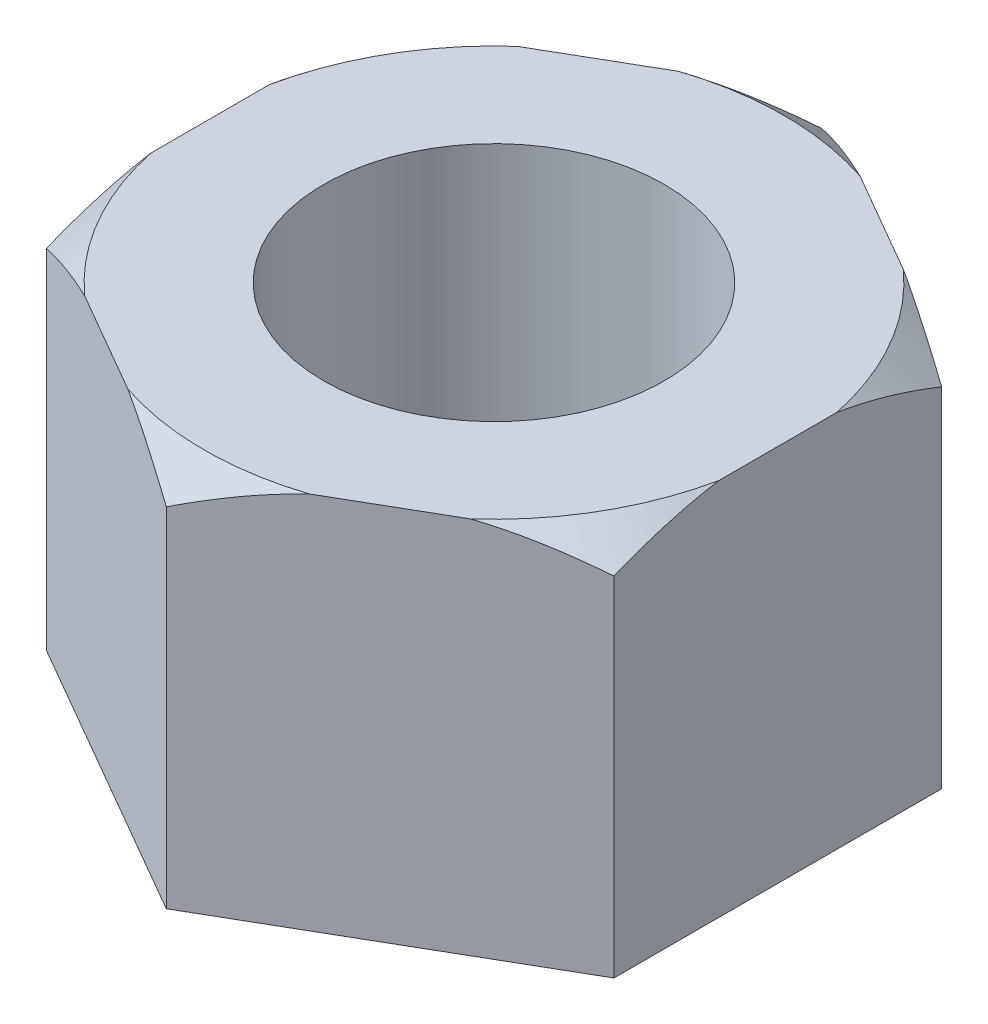
ISO-10303-21;
HEADER;
FILE_DESCRIPTION(('STEP AP214'),'2;1');
FILE_NAME('part.step','',(''),(''),'','','');
FILE_SCHEMA(('AUTOMOTIVE_DESIGN { 1 0 10303 214 1 1 1 1 }'));
ENDSEC;
DATA;
#1=APPLICATION_CONTEXT('core data for automotive mechanical design processes');
#2=APPLICATION_PROTOCOL_DEFINITION('international standard','automotive_design',2000,#1);
#3=PRODUCT_CONTEXT('',#1,'mechanical');
#4=PRODUCT('Part','Part','',(#3));
#5=PRODUCT_RELATED_PRODUCT_CATEGORY('part','',(#4));
#6=PRODUCT_DEFINITION_FORMATION('','',#4);
#7=PRODUCT_DEFINITION_CONTEXT('part definition',#1,'design');
#8=PRODUCT_DEFINITION('design','',#6,#7);
#9=PRODUCT_DEFINITION_SHAPE('','',#8);
#10=(LENGTH_UNIT() NAMED_UNIT(*) SI_UNIT(.MILLI.,.METRE.));
#11=(NAMED_UNIT(*) PLANE_ANGLE_UNIT() SI_UNIT($,.RADIAN.));
#12=(NAMED_UNIT(*) SI_UNIT($,.STERADIAN.) SOLID_ANGLE_UNIT());
#13=UNCERTAINTY_MEASURE_WITH_UNIT(LENGTH_MEASURE(1.E-05),#10,'distance_accuracy_value','');
#14=(GEOMETRIC_REPRESENTATION_CONTEXT(3) GLOBAL_UNCERTAINTY_ASSIGNED_CONTEXT((#13)) GLOBAL_UNIT_ASSIGNED_CONTEXT((#10,
#11,#12)) REPRESENTATION_CONTEXT('',''));
#15=CARTESIAN_POINT('',(0.,0.,0.));
#16=DIRECTION('',(0.,0.,1.));
#17=DIRECTION('',(1.,0.,0.));
#18=AXIS2_PLACEMENT_3D('',#15,#16,#17);
#19=CARTESIAN_POINT('',(7.5,10.,4.3301270189222));
#20=DIRECTION('',(-1.,0.,0.));
#21=DIRECTION('',(0.,0.,1.));
#22=AXIS2_PLACEMENT_3D('',#19,#20,#21);
#23=PLANE('',#22);
#24=CARTESIAN_POINT('',(7.5,6.4146807288749,9.54860259616033));
#25=CARTESIAN_POINT('',(7.5,6.55866470793268,9.31969888326524));
#26=CARTESIAN_POINT('',(7.5,6.70127608196248,9.08991961782729));
#27=CARTESIAN_POINT('',(7.5,6.9831614984986,8.62827495631653));
#28=CARTESIAN_POINT('',(7.5,7.12243500815842,8.39640923518796));
#29=CARTESIAN_POINT('',(7.5,7.39761066195499,7.92930352378797));
#30=CARTESIAN_POINT('',(7.5,7.53349527279304,7.6940531747953));
#31=CARTESIAN_POINT('',(7.5,7.80042851570543,7.22083136773926));
#32=CARTESIAN_POINT('',(7.5,7.93147735724859,6.98286002812605));
#33=CARTESIAN_POINT('',(7.5,8.19348714057653,6.49301317702861));
#34=CARTESIAN_POINT('',(7.5,8.32417949383914,6.24099340191937));
#35=CARTESIAN_POINT('',(7.5,8.57772029321263,5.73299371520247));
#36=CARTESIAN_POINT('',(7.5,8.70056809257681,5.47701347922916));
#37=CARTESIAN_POINT('',(7.5,8.93635393995992,4.96099736227989));
#38=CARTESIAN_POINT('',(7.5,9.04930763315424,4.70096867898878));
#39=CARTESIAN_POINT('',(7.5,9.26318122287672,4.17604149538977));
#40=CARTESIAN_POINT('',(7.5,9.36410386088361,3.91114412043492));
#41=CARTESIAN_POINT('',(7.5,9.55957482296783,3.35198287202365));
#42=CARTESIAN_POINT('',(7.5,9.6527283966905,3.05722436483859));
#43=CARTESIAN_POINT('',(7.5,9.81725088359778,2.4615957159776));
#44=CARTESIAN_POINT('',(7.5,9.8886203231011,2.16072572214649));
#45=CARTESIAN_POINT('',(7.5,10.0043803715225,1.55869513994768));
#46=CARTESIAN_POINT('',(7.5,10.0491814702344,1.25761506323823));
#47=CARTESIAN_POINT('',(7.5,10.1103156838857,0.652561136736859));
#48=CARTESIAN_POINT('',(7.5,10.1266535688715,0.34858778040604));
#49=CARTESIAN_POINT('',(7.5,10.1295486049696,-0.261048804335957));
#50=CARTESIAN_POINT('',(7.5,10.1159542142384,-0.566712780577731));
#51=CARTESIAN_POINT('',(7.5,10.0597955361564,-1.1753525230448));
#52=CARTESIAN_POINT('',(7.5,10.0172264452488,-1.47832783509278));
#53=CARTESIAN_POINT('',(7.5,9.9053632745284,-2.08429329149563));
#54=CARTESIAN_POINT('',(7.5,9.83564650006926,-2.38720380645196));
#55=CARTESIAN_POINT('',(7.5,9.67384662527949,-2.98689489645898));
#56=CARTESIAN_POINT('',(7.5,9.58176280560265,-3.28367527402525));
#57=CARTESIAN_POINT('',(7.5,9.38737033536774,-3.84810885844041));
#58=CARTESIAN_POINT('',(7.5,9.28641155947947,-4.11623386519152));
#59=CARTESIAN_POINT('',(7.5,9.07201796623266,-4.64748421059007));
#60=CARTESIAN_POINT('',(7.5,8.95858013158622,-4.91060832196496));
#61=CARTESIAN_POINT('',(7.5,8.72147599881307,-5.43271599161977));
#62=CARTESIAN_POINT('',(7.5,8.59779258307476,-5.69169172133084));
#63=CARTESIAN_POINT('',(7.5,8.34232617541051,-6.20556826875717));
#64=CARTESIAN_POINT('',(7.5,8.21054388966427,-6.46046943931761));
#65=CARTESIAN_POINT('',(7.5,7.94625276501215,-6.95579164422827));
#66=CARTESIAN_POINT('',(7.5,7.81402230609473,-7.19636185504697));
#67=CARTESIAN_POINT('',(7.5,7.54459545688915,-7.67471235741192));
#68=CARTESIAN_POINT('',(7.5,7.40739884233038,-7.91249252231653));
#69=CARTESIAN_POINT('',(7.5,7.12953897907714,-8.38453409101417));
#70=CARTESIAN_POINT('',(7.5,6.98889466591913,-8.61880667378094));
#71=CARTESIAN_POINT('',(7.5,6.70419337824544,-9.08521788143551));
#72=CARTESIAN_POINT('',(7.5,6.56013697109618,-9.31735685231481));
#73=CARTESIAN_POINT('',(7.5,6.41468072887491,-9.54860259616033));
#74=B_SPLINE_CURVE_WITH_KNOTS('',3,(#24,#25,#26,#27,#28,#29,#30,#31,#32,#33,#34,#35,#36,#37,#38,
#39,#40,#41,#42,#43,#44,#45,#46,#47,#48,#49,#50,#51,#52,#53,#54,#55,#56,#57,#58,#59,#60,#61,#62,
#63,#64,#65,#66,#67,#68,#69,#70,#71,#72,#73),.UNSPECIFIED.,.F.,.F.,(4,2,2,2,2,2,2,2,2,2,2,2,2,2,
2,2,2,2,2,2,2,2,2,2,4),(0.,0.811277740605028,1.62268413990396,2.43766124898074,3.25260301452779,
4.10416631223329,4.95579972693622,5.80606121432494,6.65612858345475,7.58282625313955,
8.50950153143905,9.42145882476036,10.3332632717645,11.2496946338952,12.1662779631802,
13.0977432745438,14.0292385467162,14.8883768137919,15.7477232687539,16.6085355946927,
17.4692729684363,18.2927515516822,19.1162673695701,19.93598005651,20.7555573846301),.UNSPECIFIED.);
#75=CARTESIAN_POINT('',(7.5,9.2,4.3301270189222));
#76=VERTEX_POINT('',#75);
#77=CARTESIAN_POINT('',(7.5,10.,1.55868275293956));
#78=VERTEX_POINT('',#77);
#79=EDGE_CURVE('E246',#76,#78,#74,.T.);
#80=ORIENTED_EDGE('',*,*,#79,.F.);
#81=DIRECTION('',(0.,-1.,0.));
#82=VECTOR('',#81,1.);
#83=CARTESIAN_POINT('',(7.5,10.,4.3301270189222));
#84=LINE('',#83,#82);
#85=CARTESIAN_POINT('',(7.5,0.,4.3301270189222));
#86=VERTEX_POINT('',#85);
#87=EDGE_CURVE('E163',#76,#86,#84,.T.);
#88=ORIENTED_EDGE('',*,*,#87,.T.);
#89=DIRECTION('',(0.,0.,-1.));
#90=VECTOR('',#89,1.);
#91=CARTESIAN_POINT('',(7.5,0.,4.3301270189222));
#92=LINE('',#91,#90);
#93=CARTESIAN_POINT('',(7.5,0.,-4.33012701892219));
#94=VERTEX_POINT('',#93);
#95=EDGE_CURVE('E164',#86,#94,#92,.T.);
#96=ORIENTED_EDGE('',*,*,#95,.T.);
#97=DIRECTION('',(0.,-1.,0.));
#98=VECTOR('',#97,1.);
#99=CARTESIAN_POINT('',(7.5,10.,-4.33012701892219));
#100=LINE('',#99,#98);
#101=CARTESIAN_POINT('',(7.50000000000001,9.2,-4.33012701892219));
#102=VERTEX_POINT('',#101);
#103=EDGE_CURVE('E188',#102,#94,#100,.T.);
#104=ORIENTED_EDGE('',*,*,#103,.F.);
#105=CARTESIAN_POINT('',(7.5,10.,-1.55868275293956));
#106=VERTEX_POINT('',#105);
#107=EDGE_CURVE('E168',#106,#102,#74,.T.);
#108=ORIENTED_EDGE('',*,*,#107,.F.);
#109=DIRECTION('',(0.,0.,-1.));
#110=VECTOR('',#109,1.);
#111=CARTESIAN_POINT('',(7.5,10.,4.3301270189222));
#112=LINE('',#111,#110);
#113=EDGE_CURVE('E149',#78,#106,#112,.T.);
#114=ORIENTED_EDGE('',*,*,#113,.F.);
#115=EDGE_LOOP('',(#80,#88,#96,#104,#108,#114));
#116=FACE_BOUND('',#115,.T.);
#117=ADVANCED_FACE('F34',(#116),#23,.F.);
#118=CARTESIAN_POINT('',(7.5,10.,-4.33012701892219));
#119=DIRECTION('',(-0.5,0.,0.866025403784438));
#120=DIRECTION('',(0.866025403784438,0.,0.5));
#121=AXIS2_PLACEMENT_3D('',#118,#119,#120);
#122=PLANE('',#121);
#123=CARTESIAN_POINT('',(12.7184755772381,5.8989983296073,-1.31723873964426));
#124=CARTESIAN_POINT('',(12.5243502850892,6.04421555853221,-1.42931702932297));
#125=CARTESIAN_POINT('',(12.3295944219355,6.18832061822437,-1.54175937934103));
#126=CARTESIAN_POINT('',(11.9385954425742,6.4738621209527,-1.76750274532811));
#127=CARTESIAN_POINT('',(11.7423521833624,6.61529830271068,-1.88080384386069));
#128=CARTESIAN_POINT('',(11.3476781455406,6.89539258545051,-2.10866900583928));
#129=CARTESIAN_POINT('',(11.149243009079,7.03404251662476,-2.22323558529205));
#130=CARTESIAN_POINT('',(10.7504415445799,7.30758100705959,-2.45348371817387));
#131=CARTESIAN_POINT('',(10.550075268657,7.44246966744344,-2.56916524151446));
#132=CARTESIAN_POINT('',(10.1378822340322,7.7138317082138,-2.80714500101316));
#133=CARTESIAN_POINT('',(9.92595110986029,7.85009436434028,-2.92950349260348));
#134=CARTESIAN_POINT('',(9.49928652802421,8.11663326408466,-3.17583840378022));
#135=CARTESIAN_POINT('',(9.28455319380478,8.24690977027282,-3.29981475209579));
#136=CARTESIAN_POINT('',(8.85204321072868,8.50002443785826,-3.54952450725198));
#137=CARTESIAN_POINT('',(8.63426938545827,8.62286900022022,-3.67525628389431));
#138=CARTESIAN_POINT('',(8.19508815512445,8.85952316699067,-3.92881768545057));
#139=CARTESIAN_POINT('',(7.97368123390392,8.97333396288743,-4.05664703101769));
#140=CARTESIAN_POINT('',(7.49455265710063,9.20543657288756,-4.33327204381151));
#141=CARTESIAN_POINT('',(7.2361985313122,9.32200774288982,-4.48243286788171));
#142=CARTESIAN_POINT('',(6.71370360269358,9.53664805961345,-4.78409545556988));
#143=CARTESIAN_POINT('',(6.44956262853113,9.63471665769733,-4.93659731810658));
#144=CARTESIAN_POINT('',(5.91995172016573,9.80629404308821,-5.24236831861711));
#145=CARTESIAN_POINT('',(5.65457504656057,9.88018013554724,-5.3955836125597));
#146=CARTESIAN_POINT('',(5.11921600343416,10.0010181522418,-5.70467330022183));
#147=CARTESIAN_POINT('',(4.84923451867346,10.0479751918635,-5.86054718312464));
#148=CARTESIAN_POINT('',(4.30290916010559,10.1117692479579,-6.17596827595892));
#149=CARTESIAN_POINT('',(4.02652843626419,10.1281968774021,-6.33553676126757));
#150=CARTESIAN_POINT('',(3.4737747413206,10.1282095798713,-6.65466925583881));
#151=CARTESIAN_POINT('',(3.19740177017824,10.1117953488751,-6.81423326512459));
#152=CARTESIAN_POINT('',(2.64261191867031,10.0470334963461,-7.13454133523637));
#153=CARTESIAN_POINT('',(2.36424513927631,9.99812704049393,-7.29525647025294));
#154=CARTESIAN_POINT('',(1.81250730789778,9.87182749108949,-7.61380245572144));
#155=CARTESIAN_POINT('',(1.53913650981073,9.79443295396545,-7.77163315958558));
#156=CARTESIAN_POINT('',(0.969081298006805,9.60652279375089,-8.10075468957353));
#157=CARTESIAN_POINT('',(0.673068637860406,9.49333235194954,-8.27165767859259));
#158=CARTESIAN_POINT('',(0.0881197627511148,9.2445232857301,-8.6093780690991));
#159=CARTESIAN_POINT('',(-0.20081188244584,9.10889059407921,-8.77619283223097));
#160=CARTESIAN_POINT('',(-0.773285390285749,8.81998492416099,-9.10671056608627));
#161=CARTESIAN_POINT('',(-1.05680110653056,8.66664363149776,-9.2703984411797));
#162=CARTESIAN_POINT('',(-1.61812782735235,8.3468989499349,-9.59448057454949));
#163=CARTESIAN_POINT('',(-1.89594006584022,8.18049842469927,-9.75487554522464));
#164=CARTESIAN_POINT('',(-2.43341136742252,7.84600106515578,-10.0651847458749));
#165=CARTESIAN_POINT('',(-2.69329509338522,7.67838252010584,-10.2152286850174));
#166=CARTESIAN_POINT('',(-3.20950539518864,7.33596532413344,-10.5132628417221));
#167=CARTESIAN_POINT('',(-3.46583167965445,7.16116608966046,-10.6612528910588));
#168=CARTESIAN_POINT('',(-3.97295962568591,6.80764202577994,-10.9540433472137));
#169=CARTESIAN_POINT('',(-4.22379088136879,6.62897358019585,-11.0988608402033));
#170=CARTESIAN_POINT('',(-4.72290996080319,6.26712504051059,-11.3870273750725));
#171=CARTESIAN_POINT('',(-4.97119844905564,6.08394617004109,-11.5303768006017));
#172=CARTESIAN_POINT('',(-5.21847557723813,5.8989983296073,-11.6731423171223));
#173=B_SPLINE_CURVE_WITH_KNOTS('',3,(#123,#124,#125,#126,#127,#128,#129,#130,#131,#132,#133,
#134,#135,#136,#137,#138,#139,#140,#141,#142,#143,#144,#145,#146,#147,#148,#149,#150,#151,#152,
#153,#154,#155,#156,#157,#158,#159,#160,#161,#162,#163,#164,#165,#166,#167,#168,#169,#170,#171,
#172),.UNSPECIFIED.,.F.,.F.,(4,2,2,2,2,2,2,2,2,2,2,2,2,2,2,2,2,2,2,2,2,2,2,2,4),(0.,
0.801260175970938,1.60259839107477,2.40601796174139,3.20941591128102,4.0496360731215,
4.88981934516788,5.72926837085867,6.56860649470337,7.5289850593744,8.48939209667592,
9.43400791684239,10.3784442402903,11.3354561531533,12.2924477854061,13.2663401902438,
14.2402819517627,15.3194374101153,16.3992718842948,17.4834206984393,18.5673324381988,
19.5983954401868,20.6295423996074,21.6504268575923,22.6710373469262),.UNSPECIFIED.);
#174=CARTESIAN_POINT('',(5.09985886048633,10.,-5.7158491519135));
#175=VERTEX_POINT('',#174);
#176=EDGE_CURVE('E142',#102,#175,#173,.T.);
#177=ORIENTED_EDGE('',*,*,#176,.F.);
#178=ORIENTED_EDGE('',*,*,#103,.T.);
#179=DIRECTION('',(-0.866025403784438,0.,-0.5));
#180=VECTOR('',#179,1.);
#181=CARTESIAN_POINT('',(7.5,0.,-4.33012701892219));
#182=LINE('',#181,#180);
#183=CARTESIAN_POINT('',(0.,0.,-8.66025403784439));
#184=VERTEX_POINT('',#183);
#185=EDGE_CURVE('E167',#94,#184,#182,.T.);
#186=ORIENTED_EDGE('',*,*,#185,.T.);
#187=DIRECTION('',(0.,-1.,0.));
#188=VECTOR('',#187,1.);
#189=CARTESIAN_POINT('',(0.,10.,-8.66025403784439));
#190=LINE('',#189,#188);
#191=CARTESIAN_POINT('',(0.,9.2,-8.66025403784439));
#192=VERTEX_POINT('',#191);
#193=EDGE_CURVE('E141',#192,#184,#190,.T.);
#194=ORIENTED_EDGE('',*,*,#193,.F.);
#195=CARTESIAN_POINT('',(2.40014113951367,10.,-7.27453190485307));
#196=VERTEX_POINT('',#195);
#197=EDGE_CURVE('E126',#196,#192,#173,.T.);
#198=ORIENTED_EDGE('',*,*,#197,.F.);
#199=DIRECTION('',(-0.866025403784438,0.,-0.5));
#200=VECTOR('',#199,1.);
#201=CARTESIAN_POINT('',(7.5,10.,-4.33012701892219));
#202=LINE('',#201,#200);
#203=EDGE_CURVE('E139',#175,#196,#202,.T.);
#204=ORIENTED_EDGE('',*,*,#203,.F.);
#205=EDGE_LOOP('',(#177,#178,#186,#194,#198,#204));
#206=FACE_BOUND('',#205,.T.);
#207=ADVANCED_FACE('F138',(#206),#122,.F.);
#208=CARTESIAN_POINT('',(0.,10.,-8.66025403784439));
#209=DIRECTION('',(0.5,0.,0.866025403784439));
#210=DIRECTION('',(0.866025403784439,0.,-0.5));
#211=AXIS2_PLACEMENT_3D('',#208,#209,#210);
#212=PLANE('',#211);
#213=CARTESIAN_POINT('',(5.21847557723814,5.8989983296073,-11.6731423171223));
#214=CARTESIAN_POINT('',(5.02435028508919,6.04421555853221,-11.5610640274436));
#215=CARTESIAN_POINT('',(4.82959442193546,6.18832061822437,-11.4486216774255));
#216=CARTESIAN_POINT('',(4.43859544257423,6.4738621209527,-11.2228783114385));
#217=CARTESIAN_POINT('',(4.24235218336242,6.61529830271068,-11.1095772129059));
#218=CARTESIAN_POINT('',(3.8476781455406,6.89539258545051,-10.8817120509273));
#219=CARTESIAN_POINT('',(3.64924300907903,7.03404251662476,-10.7671454714745));
#220=CARTESIAN_POINT('',(3.25044154457985,7.30758100705959,-10.5368973385927));
#221=CARTESIAN_POINT('',(3.05007526865698,7.44246966744344,-10.4212158152521));
#222=CARTESIAN_POINT('',(2.6378822340322,7.7138317082138,-10.1832360557534));
#223=CARTESIAN_POINT('',(2.42595110986029,7.85009436434028,-10.0608775641631));
#224=CARTESIAN_POINT('',(1.99928652802421,8.11663326408466,-9.81454265298636));
#225=CARTESIAN_POINT('',(1.78455319380478,8.24690977027282,-9.69056630467078));
#226=CARTESIAN_POINT('',(1.35204321072868,8.50002443785826,-9.4408565495146));
#227=CARTESIAN_POINT('',(1.13426938545826,8.62286900022022,-9.31512477287227));
#228=CARTESIAN_POINT('',(0.695088155124448,8.85952316699067,-9.06156337131601));
#229=CARTESIAN_POINT('',(0.47368123390392,8.97333396288743,-8.93373402574889));
#230=CARTESIAN_POINT('',(-0.0054473428993747,9.20543657288756,-8.65710901295506));
#231=CARTESIAN_POINT('',(-0.263801468687802,9.32200774288982,-8.50794818888487));
#232=CARTESIAN_POINT('',(-0.786296397306419,9.53664805961345,-8.20628560119669));
#233=CARTESIAN_POINT('',(-1.05043737146887,9.63471665769733,-8.05378373865999));
#234=CARTESIAN_POINT('',(-1.58004827983427,9.80629404308821,-7.74801273814947));
#235=CARTESIAN_POINT('',(-1.84542495343943,9.88018013554724,-7.59479744420688));
#236=CARTESIAN_POINT('',(-2.38078399656584,10.0010181522418,-7.28570775654475));
#237=CARTESIAN_POINT('',(-2.65076548132655,10.0479751918635,-7.12983387364194));
#238=CARTESIAN_POINT('',(-3.19709083989442,10.1117692479579,-6.81441278080766));
#239=CARTESIAN_POINT('',(-3.47347156373582,10.1281968774021,-6.654844295499));
#240=CARTESIAN_POINT('',(-4.0262252586794,10.1282095798713,-6.33571180092776));
#241=CARTESIAN_POINT('',(-4.30259822982177,10.1117953488751,-6.17614779164198));
#242=CARTESIAN_POINT('',(-4.8573880813297,10.0470334963461,-5.8558397215302));
#243=CARTESIAN_POINT('',(-5.1357548607237,9.99812704049393,-5.69512458651363));
#244=CARTESIAN_POINT('',(-5.68749269210222,9.87182749108949,-5.37657860104514));
#245=CARTESIAN_POINT('',(-5.96086349018927,9.79443295396545,-5.218747897181));
#246=CARTESIAN_POINT('',(-6.5309187019932,9.60652279375088,-4.88962636719305));
#247=CARTESIAN_POINT('',(-6.8269313621396,9.49333235194954,-4.71872337817399));
#248=CARTESIAN_POINT('',(-7.41188023724889,9.24452328573009,-4.38100298766747));
#249=CARTESIAN_POINT('',(-7.70081188244584,9.10889059407921,-4.21418822453561));
#250=CARTESIAN_POINT('',(-8.27328539028575,8.81998492416099,-3.88367049068031));
#251=CARTESIAN_POINT('',(-8.55680110653056,8.66664363149776,-3.71998261558688));
#252=CARTESIAN_POINT('',(-9.11812782735235,8.3468989499349,-3.39590048221709));
#253=CARTESIAN_POINT('',(-9.39594006584022,8.18049842469927,-3.23550551154194));
#254=CARTESIAN_POINT('',(-9.93341136742252,7.84600106515578,-2.9251963108917));
#255=CARTESIAN_POINT('',(-10.1932950933852,7.67838252010584,-2.77515237174914));
#256=CARTESIAN_POINT('',(-10.7095053951886,7.33596532413344,-2.47711821504448));
#257=CARTESIAN_POINT('',(-10.9658316796545,7.16116608966046,-2.32912816570776));
#258=CARTESIAN_POINT('',(-11.4729596256859,6.80764202577994,-2.03633770955292));
#259=CARTESIAN_POINT('',(-11.7237908813688,6.62897358019585,-1.89152021656324));
#260=CARTESIAN_POINT('',(-12.2229099608032,6.26712504051059,-1.6033536816941));
#261=CARTESIAN_POINT('',(-12.4711984490556,6.08394617004109,-1.46000425616487));
#262=CARTESIAN_POINT('',(-12.7184755772381,5.8989983296073,-1.31723873964427));
#263=B_SPLINE_CURVE_WITH_KNOTS('',3,(#213,#214,#215,#216,#217,#218,#219,#220,#221,#222,#223,
#224,#225,#226,#227,#228,#229,#230,#231,#232,#233,#234,#235,#236,#237,#238,#239,#240,#241,#242,
#243,#244,#245,#246,#247,#248,#249,#250,#251,#252,#253,#254,#255,#256,#257,#258,#259,#260,#261,
#262),.UNSPECIFIED.,.F.,.F.,(4,2,2,2,2,2,2,2,2,2,2,2,2,2,2,2,2,2,2,2,2,2,2,2,4),(0.,
0.801260175970937,1.60259839107477,2.40601796174139,3.20941591128102,4.0496360731215,
4.88981934516788,5.72926837085867,6.56860649470337,7.52898505937439,8.48939209667592,
9.43400791684239,10.3784442402903,11.3354561531534,12.2924477854061,13.2663401902438,
14.2402819517627,15.3194374101153,16.3992718842948,17.4834206984393,18.5673324381988,
19.5983954401868,20.6295423996074,21.6504268575923,22.6710373469262),.UNSPECIFIED.);
#264=CARTESIAN_POINT('',(-2.40014113951367,10.,-7.27453190485307));
#265=VERTEX_POINT('',#264);
#266=EDGE_CURVE('E128',#192,#265,#263,.T.);
#267=ORIENTED_EDGE('',*,*,#266,.F.);
#268=ORIENTED_EDGE('',*,*,#193,.T.);
#269=DIRECTION('',(-0.866025403784439,0.,0.5));
#270=VECTOR('',#269,1.);
#271=CARTESIAN_POINT('',(0.,0.,-8.66025403784439));
#272=LINE('',#271,#270);
#273=CARTESIAN_POINT('',(-7.5,0.,-4.33012701892219));
#274=VERTEX_POINT('',#273);
#275=EDGE_CURVE('E170',#184,#274,#272,.T.);
#276=ORIENTED_EDGE('',*,*,#275,.T.);
#277=DIRECTION('',(0.,-1.,0.));
#278=VECTOR('',#277,1.);
#279=CARTESIAN_POINT('',(-7.5,10.,-4.33012701892219));
#280=LINE('',#279,#278);
#281=CARTESIAN_POINT('',(-7.5,9.2,-4.3301270189222));
#282=VERTEX_POINT('',#281);
#283=EDGE_CURVE('E186',#282,#274,#280,.T.);
#284=ORIENTED_EDGE('',*,*,#283,.F.);
#285=CARTESIAN_POINT('',(-5.09985886048633,10.,-5.71584915191351));
#286=VERTEX_POINT('',#285);
#287=EDGE_CURVE('E207',#286,#282,#263,.T.);
#288=ORIENTED_EDGE('',*,*,#287,.F.);
#289=DIRECTION('',(-0.866025403784439,0.,0.5));
#290=VECTOR('',#289,1.);
#291=CARTESIAN_POINT('',(0.,10.,-8.66025403784439));
#292=LINE('',#291,#290);
#293=EDGE_CURVE('E148',#265,#286,#292,.T.);
#294=ORIENTED_EDGE('',*,*,#293,.F.);
#295=EDGE_LOOP('',(#267,#268,#276,#284,#288,#294));
#296=FACE_BOUND('',#295,.T.);
#297=ADVANCED_FACE('F260',(#296),#212,.F.);
#298=CARTESIAN_POINT('',(-7.5,10.,-4.33012701892219));
#299=DIRECTION('',(1.,0.,0.));
#300=DIRECTION('',(0.,0.,-1.));
#301=AXIS2_PLACEMENT_3D('',#298,#299,#300);
#302=PLANE('',#301);
#303=CARTESIAN_POINT('',(-7.5,6.41468072887491,-9.54860259616033));
#304=CARTESIAN_POINT('',(-7.5,6.55866470793268,-9.31969888326524));
#305=CARTESIAN_POINT('',(-7.5,6.70127608196248,-9.08991961782728));
#306=CARTESIAN_POINT('',(-7.5,6.98316149849861,-8.62827495631652));
#307=CARTESIAN_POINT('',(-7.5,7.12243500815842,-8.39640923518795));
#308=CARTESIAN_POINT('',(-7.5,7.397610661955,-7.92930352378796));
#309=CARTESIAN_POINT('',(-7.5,7.53349527279304,-7.6940531747953));
#310=CARTESIAN_POINT('',(-7.5,7.80042851570544,-7.22083136773925));
#311=CARTESIAN_POINT('',(-7.5,7.9314773572486,-6.98286002812605));
#312=CARTESIAN_POINT('',(-7.5,8.19348714057654,-6.4930131770286));
#313=CARTESIAN_POINT('',(-7.5,8.32417949383914,-6.24099340191936));
#314=CARTESIAN_POINT('',(-7.5,8.57772029321263,-5.73299371520246));
#315=CARTESIAN_POINT('',(-7.5,8.70056809257682,-5.47701347922915));
#316=CARTESIAN_POINT('',(-7.5,8.93635393995993,-4.96099736227988));
#317=CARTESIAN_POINT('',(-7.5,9.04930763315424,-4.70096867898877));
#318=CARTESIAN_POINT('',(-7.5,9.26318122287672,-4.17604149538976));
#319=CARTESIAN_POINT('',(-7.5,9.36410386088362,-3.91114412043491));
#320=CARTESIAN_POINT('',(-7.5,9.55957482296783,-3.35198287202363));
#321=CARTESIAN_POINT('',(-7.5,9.6527283966905,-3.05722436483857));
#322=CARTESIAN_POINT('',(-7.5,9.81725088359778,-2.46159571597759));
#323=CARTESIAN_POINT('',(-7.5,9.88862032310111,-2.16072572214647));
#324=CARTESIAN_POINT('',(-7.5,10.0043803715225,-1.55869513994767));
#325=CARTESIAN_POINT('',(-7.5,10.0491814702344,-1.25761506323822));
#326=CARTESIAN_POINT('',(-7.5,10.1103156838857,-0.652561136736846));
#327=CARTESIAN_POINT('',(-7.5,10.1266535688715,-0.348587780406028));
#328=CARTESIAN_POINT('',(-7.5,10.1295486049696,0.261048804335969));
#329=CARTESIAN_POINT('',(-7.5,10.1159542142384,0.566712780577743));
#330=CARTESIAN_POINT('',(-7.5,10.0597955361564,1.17535252304481));
#331=CARTESIAN_POINT('',(-7.5,10.0172264452488,1.47832783509279));
#332=CARTESIAN_POINT('',(-7.5,9.9053632745284,2.08429329149564));
#333=CARTESIAN_POINT('',(-7.5,9.83564650006926,2.38720380645197));
#334=CARTESIAN_POINT('',(-7.5,9.67384662527949,2.98689489645899));
#335=CARTESIAN_POINT('',(-7.5,9.58176280560265,3.28367527402526));
#336=CARTESIAN_POINT('',(-7.5,9.38737033536774,3.84810885844042));
#337=CARTESIAN_POINT('',(-7.5,9.28641155947947,4.11623386519153));
#338=CARTESIAN_POINT('',(-7.5,9.07201796623265,4.64748421059008));
#339=CARTESIAN_POINT('',(-7.5,8.95858013158622,4.91060832196497));
#340=CARTESIAN_POINT('',(-7.5,8.72147599881307,5.43271599161979));
#341=CARTESIAN_POINT('',(-7.5,8.59779258307476,5.69169172133085));
#342=CARTESIAN_POINT('',(-7.5,8.34232617541051,6.20556826875718));
#343=CARTESIAN_POINT('',(-7.5,8.21054388966427,6.46046943931761));
#344=CARTESIAN_POINT('',(-7.5,7.94625276501215,6.95579164422828));
#345=CARTESIAN_POINT('',(-7.5,7.81402230609472,7.19636185504698));
#346=CARTESIAN_POINT('',(-7.5,7.54459545688914,7.67471235741193));
#347=CARTESIAN_POINT('',(-7.5,7.40739884233038,7.91249252231654));
#348=CARTESIAN_POINT('',(-7.5,7.12953897907714,8.38453409101417));
#349=CARTESIAN_POINT('',(-7.5,6.98889466591912,8.61880667378094));
#350=CARTESIAN_POINT('',(-7.5,6.70419337824543,9.08521788143552));
#351=CARTESIAN_POINT('',(-7.5,6.56013697109618,9.31735685231482));
#352=CARTESIAN_POINT('',(-7.5,6.41468072887491,9.54860259616033));
#353=B_SPLINE_CURVE_WITH_KNOTS('',3,(#303,#304,#305,#306,#307,#308,#309,#310,#311,#312,#313,
#314,#315,#316,#317,#318,#319,#320,#321,#322,#323,#324,#325,#326,#327,#328,#329,#330,#331,#332,
#333,#334,#335,#336,#337,#338,#339,#340,#341,#342,#343,#344,#345,#346,#347,#348,#349,#350,#351,
#352),.UNSPECIFIED.,.F.,.F.,(4,2,2,2,2,2,2,2,2,2,2,2,2,2,2,2,2,2,2,2,2,2,2,2,4),(0.,
0.811277740605029,1.62268413990396,2.43766124898074,3.2526030145278,4.10416631223329,
4.95579972693623,5.80606121432494,6.65612858345476,7.58282625313956,8.50950153143906,
9.42145882476037,10.3332632717645,11.2496946338952,12.1662779631802,13.0977432745438,
14.0292385467162,14.8883768137919,15.7477232687539,16.6085355946927,17.4692729684363,
18.2927515516822,19.11626736957,19.93598005651,20.7555573846301),.UNSPECIFIED.);
#354=CARTESIAN_POINT('',(-7.5,10.,-1.55868275293957));
#355=VERTEX_POINT('',#354);
#356=EDGE_CURVE('E202',#282,#355,#353,.T.);
#357=ORIENTED_EDGE('',*,*,#356,.F.);
#358=ORIENTED_EDGE('',*,*,#283,.T.);
#359=DIRECTION('',(0.,0.,1.));
#360=VECTOR('',#359,1.);
#361=CARTESIAN_POINT('',(-7.5,0.,-4.33012701892219));
#362=LINE('',#361,#360);
#363=CARTESIAN_POINT('',(-7.5,0.,4.33012701892219));
#364=VERTEX_POINT('',#363);
#365=EDGE_CURVE('E173',#274,#364,#362,.T.);
#366=ORIENTED_EDGE('',*,*,#365,.T.);
#367=DIRECTION('',(0.,-1.,0.));
#368=VECTOR('',#367,1.);
#369=CARTESIAN_POINT('',(-7.5,10.,4.33012701892219));
#370=LINE('',#369,#368);
#371=CARTESIAN_POINT('',(-7.50000000000001,9.2,4.33012701892219));
#372=VERTEX_POINT('',#371);
#373=EDGE_CURVE('E184',#372,#364,#370,.T.);
#374=ORIENTED_EDGE('',*,*,#373,.F.);
#375=CARTESIAN_POINT('',(-7.5,10.,1.55868275293957));
#376=VERTEX_POINT('',#375);
#377=EDGE_CURVE('E205',#376,#372,#353,.T.);
#378=ORIENTED_EDGE('',*,*,#377,.F.);
#379=DIRECTION('',(0.,0.,1.));
#380=VECTOR('',#379,1.);
#381=CARTESIAN_POINT('',(-7.5,10.,-4.33012701892219));
#382=LINE('',#381,#380);
#383=EDGE_CURVE('E151',#355,#376,#382,.T.);
#384=ORIENTED_EDGE('',*,*,#383,.F.);
#385=EDGE_LOOP('',(#357,#358,#366,#374,#378,#384));
#386=FACE_BOUND('',#385,.T.);
#387=ADVANCED_FACE('F201',(#386),#302,.F.);
#388=CARTESIAN_POINT('',(-7.5,10.,4.33012701892219));
#389=DIRECTION('',(0.5,0.,-0.866025403784439));
#390=DIRECTION('',(-0.866025403784439,0.,-0.5));
#391=AXIS2_PLACEMENT_3D('',#388,#389,#390);
#392=PLANE('',#391);
#393=CARTESIAN_POINT('',(-12.7184755772381,5.8989983296073,1.31723873964427));
#394=CARTESIAN_POINT('',(-12.5243502850892,6.04421555853222,1.42931702932297));
#395=CARTESIAN_POINT('',(-12.3295944219355,6.18832061822437,1.54175937934104));
#396=CARTESIAN_POINT('',(-11.9385954425742,6.47386212095271,1.76750274532811));
#397=CARTESIAN_POINT('',(-11.7423521833624,6.61529830271069,1.8808038438607));
#398=CARTESIAN_POINT('',(-11.3476781455406,6.89539258545051,2.10866900583928));
#399=CARTESIAN_POINT('',(-11.149243009079,7.03404251662477,2.22323558529206));
#400=CARTESIAN_POINT('',(-10.7504415445798,7.30758100705959,2.45348371817387));
#401=CARTESIAN_POINT('',(-10.550075268657,7.44246966744344,2.56916524151446));
#402=CARTESIAN_POINT('',(-10.1378822340322,7.7138317082138,2.80714500101317));
#403=CARTESIAN_POINT('',(-9.92595110986029,7.85009436434028,2.92950349260348));
#404=CARTESIAN_POINT('',(-9.49928652802421,8.11663326408466,3.17583840378022));
#405=CARTESIAN_POINT('',(-9.28455319380477,8.24690977027282,3.2998147520958));
#406=CARTESIAN_POINT('',(-8.85204321072867,8.50002443785826,3.54952450725199));
#407=CARTESIAN_POINT('',(-8.63426938545826,8.62286900022022,3.67525628389431));
#408=CARTESIAN_POINT('',(-8.19508815512444,8.85952316699067,3.92881768545057));
#409=CARTESIAN_POINT('',(-7.97368123390391,8.97333396288743,4.05664703101769));
#410=CARTESIAN_POINT('',(-7.49455265710062,9.20543657288756,4.33327204381152));
#411=CARTESIAN_POINT('',(-7.23619853131219,9.32200774288982,4.48243286788172));
#412=CARTESIAN_POINT('',(-6.71370360269358,9.53664805961345,4.78409545556989));
#413=CARTESIAN_POINT('',(-6.44956262853112,9.63471665769734,4.93659731810659));
#414=CARTESIAN_POINT('',(-5.91995172016573,9.80629404308821,5.24236831861711));
#415=CARTESIAN_POINT('',(-5.65457504656056,9.88018013554724,5.3955836125597));
#416=CARTESIAN_POINT('',(-5.11921600343416,10.0010181522418,5.70467330022183));
#417=CARTESIAN_POINT('',(-4.84923451867345,10.0479751918635,5.86054718312464));
#418=CARTESIAN_POINT('',(-4.30290916010558,10.1117692479579,6.17596827595892));
#419=CARTESIAN_POINT('',(-4.02652843626418,10.1281968774021,6.33553676126758));
#420=CARTESIAN_POINT('',(-3.47377474132059,10.1282095798713,6.65466925583882));
#421=CARTESIAN_POINT('',(-3.19740177017823,10.1117953488751,6.8142332651246));
#422=CARTESIAN_POINT('',(-2.6426119186703,10.0470334963461,7.13454133523637));
#423=CARTESIAN_POINT('',(-2.3642451392763,9.99812704049393,7.29525647025295));
#424=CARTESIAN_POINT('',(-1.81250730789777,9.87182749108949,7.61380245572144));
#425=CARTESIAN_POINT('',(-1.53913650981073,9.79443295396544,7.77163315958558));
#426=CARTESIAN_POINT('',(-0.969081298006798,9.60652279375088,8.10075468957353));
#427=CARTESIAN_POINT('',(-0.673068637860398,9.49333235194953,8.27165767859259));
#428=CARTESIAN_POINT('',(-0.0881197627511073,9.24452328573009,8.60937806909911));
#429=CARTESIAN_POINT('',(0.200811882445847,9.10889059407921,8.77619283223097));
#430=CARTESIAN_POINT('',(0.773285390285756,8.81998492416099,9.10671056608627));
#431=CARTESIAN_POINT('',(1.05680110653057,8.66664363149776,9.2703984411797));
#432=CARTESIAN_POINT('',(1.61812782735235,8.3468989499349,9.59448057454949));
#433=CARTESIAN_POINT('',(1.89594006584023,8.18049842469927,9.75487554522464));
#434=CARTESIAN_POINT('',(2.43341136742253,7.84600106515577,10.0651847458749));
#435=CARTESIAN_POINT('',(2.69329509338523,7.67838252010584,10.2152286850174));
#436=CARTESIAN_POINT('',(3.20950539518864,7.33596532413343,10.5132628417221));
#437=CARTESIAN_POINT('',(3.46583167965446,7.16116608966046,10.6612528910588));
#438=CARTESIAN_POINT('',(3.97295962568591,6.80764202577993,10.9540433472137));
#439=CARTESIAN_POINT('',(4.22379088136879,6.62897358019584,11.0988608402033));
#440=CARTESIAN_POINT('',(4.7229099608032,6.26712504051058,11.3870273750725));
#441=CARTESIAN_POINT('',(4.97119844905564,6.08394617004109,11.5303768006017));
#442=CARTESIAN_POINT('',(5.21847557723814,5.8989983296073,11.6731423171223));
#443=B_SPLINE_CURVE_WITH_KNOTS('',3,(#393,#394,#395,#396,#397,#398,#399,#400,#401,#402,#403,
#404,#405,#406,#407,#408,#409,#410,#411,#412,#413,#414,#415,#416,#417,#418,#419,#420,#421,#422,
#423,#424,#425,#426,#427,#428,#429,#430,#431,#432,#433,#434,#435,#436,#437,#438,#439,#440,#441,
#442),.UNSPECIFIED.,.F.,.F.,(4,2,2,2,2,2,2,2,2,2,2,2,2,2,2,2,2,2,2,2,2,2,2,2,4),(0.,
0.801260175970941,1.60259839107477,2.40601796174139,3.20941591128102,4.0496360731215,
4.88981934516788,5.72926837085868,6.56860649470338,7.5289850593744,8.48939209667592,
9.4340079168424,10.3784442402903,11.3354561531534,12.2924477854061,13.2663401902438,
14.2402819517627,15.3194374101153,16.3992718842948,17.4834206984393,18.5673324381988,
19.5983954401868,20.6295423996074,21.6504268575923,22.6710373469262),.UNSPECIFIED.);
#444=CARTESIAN_POINT('',(-5.09985886048633,10.,5.71584915191351));
#445=VERTEX_POINT('',#444);
#446=EDGE_CURVE('E58',#372,#445,#443,.T.);
#447=ORIENTED_EDGE('',*,*,#446,.F.);
#448=ORIENTED_EDGE('',*,*,#373,.T.);
#449=DIRECTION('',(0.866025403784439,0.,0.5));
#450=VECTOR('',#449,1.);
#451=CARTESIAN_POINT('',(-7.5,0.,4.33012701892219));
#452=LINE('',#451,#450);
#453=CARTESIAN_POINT('',(0.,0.,8.66025403784439));
#454=VERTEX_POINT('',#453);
#455=EDGE_CURVE('E176',#364,#454,#452,.T.);
#456=ORIENTED_EDGE('',*,*,#455,.T.);
#457=DIRECTION('',(0.,-1.,0.));
#458=VECTOR('',#457,1.);
#459=CARTESIAN_POINT('',(0.,10.,8.66025403784439));
#460=LINE('',#459,#458);
#461=CARTESIAN_POINT('',(0.,9.2,8.66025403784439));
#462=VERTEX_POINT('',#461);
#463=EDGE_CURVE('E182',#462,#454,#460,.T.);
#464=ORIENTED_EDGE('',*,*,#463,.F.);
#465=CARTESIAN_POINT('',(-2.40014113951367,10.,7.27453190485307));
#466=VERTEX_POINT('',#465);
#467=EDGE_CURVE('E208',#466,#462,#443,.T.);
#468=ORIENTED_EDGE('',*,*,#467,.F.);
#469=DIRECTION('',(0.866025403784439,0.,0.5));
#470=VECTOR('',#469,1.);
#471=CARTESIAN_POINT('',(-7.5,10.,4.33012701892219));
#472=LINE('',#471,#470);
#473=EDGE_CURVE('E158',#445,#466,#472,.T.);
#474=ORIENTED_EDGE('',*,*,#473,.F.);
#475=EDGE_LOOP('',(#447,#448,#456,#464,#468,#474));
#476=FACE_BOUND('',#475,.T.);
#477=ADVANCED_FACE('F267',(#476),#392,.F.);
#478=CARTESIAN_POINT('',(0.,10.,8.66025403784439));
#479=DIRECTION('',(-0.5,0.,-0.866025403784439));
#480=DIRECTION('',(-0.866025403784439,0.,0.5));
#481=AXIS2_PLACEMENT_3D('',#478,#479,#480);
#482=PLANE('',#481);
#483=CARTESIAN_POINT('',(-5.21847557723813,5.89899832960731,11.6731423171223));
#484=CARTESIAN_POINT('',(-5.02435028508919,6.04421555853222,11.5610640274436));
#485=CARTESIAN_POINT('',(-4.82959442193545,6.18832061822437,11.4486216774255));
#486=CARTESIAN_POINT('',(-4.43859544257423,6.47386212095271,11.2228783114385));
#487=CARTESIAN_POINT('',(-4.24235218336242,6.61529830271069,11.1095772129059));
#488=CARTESIAN_POINT('',(-3.8476781455406,6.89539258545052,10.8817120509273));
#489=CARTESIAN_POINT('',(-3.64924300907902,7.03404251662477,10.7671454714745));
#490=CARTESIAN_POINT('',(-3.25044154457984,7.30758100705959,10.5368973385927));
#491=CARTESIAN_POINT('',(-3.05007526865697,7.44246966744345,10.4212158152521));
#492=CARTESIAN_POINT('',(-2.63788223403219,7.7138317082138,10.1832360557534));
#493=CARTESIAN_POINT('',(-2.42595110986028,7.85009436434029,10.0608775641631));
#494=CARTESIAN_POINT('',(-1.9992865280242,8.11663326408467,9.81454265298635));
#495=CARTESIAN_POINT('',(-1.78455319380476,8.24690977027283,9.69056630467078));
#496=CARTESIAN_POINT('',(-1.35204321072866,8.50002443785827,9.44085654951459));
#497=CARTESIAN_POINT('',(-1.13426938545825,8.62286900022022,9.31512477287226));
#498=CARTESIAN_POINT('',(-0.695088155124432,8.85952316699068,9.061563371316));
#499=CARTESIAN_POINT('',(-0.473681233903903,8.97333396288743,8.93373402574888));
#500=CARTESIAN_POINT('',(0.00544734289939248,9.20543657288756,8.65710901295506));
#501=CARTESIAN_POINT('',(0.263801468687819,9.32200774288983,8.50794818888486));
#502=CARTESIAN_POINT('',(0.786296397306436,9.53664805961345,8.20628560119668));
#503=CARTESIAN_POINT('',(1.05043737146889,9.63471665769734,8.05378373865999));
#504=CARTESIAN_POINT('',(1.58004827983429,9.80629404308821,7.74801273814946));
#505=CARTESIAN_POINT('',(1.84542495343945,9.88018013554724,7.59479744420687));
#506=CARTESIAN_POINT('',(2.38078399656586,10.0010181522418,7.28570775654474));
#507=CARTESIAN_POINT('',(2.65076548132656,10.0479751918635,7.12983387364193));
#508=CARTESIAN_POINT('',(3.19709083989443,10.1117692479579,6.81441278080765));
#509=CARTESIAN_POINT('',(3.47347156373583,10.1281968774021,6.654844295499));
#510=CARTESIAN_POINT('',(4.02622525867942,10.1282095798712,6.33571180092776));
#511=CARTESIAN_POINT('',(4.30259822982178,10.1117953488751,6.17614779164198));
#512=CARTESIAN_POINT('',(4.85738808132971,10.0470334963461,5.8558397215302));
#513=CARTESIAN_POINT('',(5.13575486072371,9.99812704049392,5.69512458651363));
#514=CARTESIAN_POINT('',(5.68749269210224,9.87182749108949,5.37657860104513));
#515=CARTESIAN_POINT('',(5.96086349018929,9.79443295396544,5.21874789718099));
#516=CARTESIAN_POINT('',(6.53091870199321,9.60652279375088,4.88962636719305));
#517=CARTESIAN_POINT('',(6.82693136213961,9.49333235194953,4.71872337817399));
#518=CARTESIAN_POINT('',(7.4118802372489,9.24452328573008,4.38100298766747));
#519=CARTESIAN_POINT('',(7.70081188244585,9.1088905940792,4.21418822453561));
#520=CARTESIAN_POINT('',(8.27328539028576,8.81998492416099,3.88367049068031));
#521=CARTESIAN_POINT('',(8.55680110653057,8.66664363149775,3.71998261558688));
#522=CARTESIAN_POINT('',(9.11812782735235,8.34689894993489,3.39590048221709));
#523=CARTESIAN_POINT('',(9.39594006584023,8.18049842469926,3.23550551154195));
#524=CARTESIAN_POINT('',(9.93341136742253,7.84600106515577,2.92519631089171));
#525=CARTESIAN_POINT('',(10.1932950933852,7.67838252010584,2.77515237174914));
#526=CARTESIAN_POINT('',(10.7095053951886,7.33596532413343,2.47711821504448));
#527=CARTESIAN_POINT('',(10.9658316796545,7.16116608966046,2.32912816570777));
#528=CARTESIAN_POINT('',(11.4729596256859,6.80764202577994,2.03633770955293));
#529=CARTESIAN_POINT('',(11.7237908813688,6.62897358019585,1.89152021656324));
#530=CARTESIAN_POINT('',(12.2229099608032,6.26712504051059,1.60335368169411));
#531=CARTESIAN_POINT('',(12.4711984490556,6.08394617004109,1.46000425616488));
#532=CARTESIAN_POINT('',(12.7184755772381,5.8989983296073,1.31723873964428));
#533=B_SPLINE_CURVE_WITH_KNOTS('',3,(#483,#484,#485,#486,#487,#488,#489,#490,#491,#492,#493,
#494,#495,#496,#497,#498,#499,#500,#501,#502,#503,#504,#505,#506,#507,#508,#509,#510,#511,#512,
#513,#514,#515,#516,#517,#518,#519,#520,#521,#522,#523,#524,#525,#526,#527,#528,#529,#530,#531,
#532),.UNSPECIFIED.,.F.,.F.,(4,2,2,2,2,2,2,2,2,2,2,2,2,2,2,2,2,2,2,2,2,2,2,2,4),(0.,
0.801260175970939,1.60259839107477,2.4060179617414,3.20941591128103,4.0496360731215,
4.88981934516788,5.72926837085868,6.56860649470338,7.52898505937441,8.48939209667593,
9.4340079168424,10.3784442402903,11.3354561531534,12.2924477854061,13.2663401902438,
14.2402819517627,15.3194374101153,16.3992718842948,17.4834206984393,18.5673324381988,
19.5983954401868,20.6295423996074,21.6504268575922,22.6710373469262),.UNSPECIFIED.);
#534=CARTESIAN_POINT('',(2.4001411395137,10.,7.27453190485307));
#535=VERTEX_POINT('',#534);
#536=EDGE_CURVE('E50',#462,#535,#533,.T.);
#537=ORIENTED_EDGE('',*,*,#536,.F.);
#538=ORIENTED_EDGE('',*,*,#463,.T.);
#539=DIRECTION('',(0.866025403784439,0.,-0.5));
#540=VECTOR('',#539,1.);
#541=CARTESIAN_POINT('',(0.,0.,8.66025403784439));
#542=LINE('',#541,#540);
#543=EDGE_CURVE('E153',#454,#86,#542,.T.);
#544=ORIENTED_EDGE('',*,*,#543,.T.);
#545=ORIENTED_EDGE('',*,*,#87,.F.);
#546=CARTESIAN_POINT('',(5.09985886048631,10.,5.71584915191352));
#547=VERTEX_POINT('',#546);
#548=EDGE_CURVE('E238',#547,#76,#533,.T.);
#549=ORIENTED_EDGE('',*,*,#548,.F.);
#550=DIRECTION('',(0.866025403784439,0.,-0.5));
#551=VECTOR('',#550,1.);
#552=CARTESIAN_POINT('',(0.,10.,8.66025403784439));
#553=LINE('',#552,#551);
#554=EDGE_CURVE('E161',#535,#547,#553,.T.);
#555=ORIENTED_EDGE('',*,*,#554,.F.);
#556=EDGE_LOOP('',(#537,#538,#544,#545,#549,#555));
#557=FACE_BOUND('',#556,.T.);
#558=ADVANCED_FACE('F276',(#557),#482,.F.);
#559=CARTESIAN_POINT('',(0.,10.,0.));
#560=DIRECTION('',(0.,1.,0.));
#561=DIRECTION('',(0.,0.,1.));
#562=AXIS2_PLACEMENT_3D('',#559,#560,#561);
#563=PLANE('',#562);
#564=CARTESIAN_POINT('',(0.,10.,0.));
#565=DIRECTION('',(0.,1.,0.));
#566=DIRECTION('',(0.,0.,1.));
#567=AXIS2_PLACEMENT_3D('',#564,#565,#566);
#568=CIRCLE('',#567,4.5);
#569=CARTESIAN_POINT('',(0.,10.,4.5));
#570=VERTEX_POINT('',#569);
#571=EDGE_CURVE('E395',#570,#570,#568,.T.);
#572=ORIENTED_EDGE('',*,*,#571,.F.);
#573=EDGE_LOOP('',(#572));
#574=FACE_BOUND('',#573,.T.);
#575=ORIENTED_EDGE('',*,*,#554,.T.);
#576=CARTESIAN_POINT('',(0.,10.,0.));
#577=DIRECTION('',(0.,1.,0.));
#578=DIRECTION('',(0.,0.,1.));
#579=AXIS2_PLACEMENT_3D('',#576,#577,#578);
#580=CIRCLE('',#579,7.66025403784439);
#581=EDGE_CURVE('E11',#547,#78,#580,.T.);
#582=ORIENTED_EDGE('',*,*,#581,.T.);
#583=ORIENTED_EDGE('',*,*,#113,.T.);
#584=EDGE_CURVE('E43',#106,#175,#580,.T.);
#585=ORIENTED_EDGE('',*,*,#584,.T.);
#586=ORIENTED_EDGE('',*,*,#203,.T.);
#587=EDGE_CURVE('E123',#196,#265,#580,.T.);
#588=ORIENTED_EDGE('',*,*,#587,.T.);
#589=ORIENTED_EDGE('',*,*,#293,.T.);
#590=EDGE_CURVE('E133',#286,#355,#580,.T.);
#591=ORIENTED_EDGE('',*,*,#590,.T.);
#592=ORIENTED_EDGE('',*,*,#383,.T.);
#593=EDGE_CURVE('E191',#376,#445,#580,.T.);
#594=ORIENTED_EDGE('',*,*,#593,.T.);
#595=ORIENTED_EDGE('',*,*,#473,.T.);
#596=EDGE_CURVE('E38',#466,#535,#580,.T.);
#597=ORIENTED_EDGE('',*,*,#596,.T.);
#598=EDGE_LOOP('',(#575,#582,#583,#585,#586,#588,#589,#591,#592,#594,#595,#597));
#599=FACE_BOUND('',#598,.T.);
#600=ADVANCED_FACE('F146',(#574,#599),#563,.T.);
#601=CARTESIAN_POINT('',(0.,0.,0.));
#602=DIRECTION('',(0.,1.,0.));
#603=DIRECTION('',(0.,0.,1.));
#604=AXIS2_PLACEMENT_3D('',#601,#602,#603);
#605=PLANE('',#604);
#606=CARTESIAN_POINT('',(0.,0.,0.));
#607=DIRECTION('',(0.,1.,0.));
#608=DIRECTION('',(0.,0.,1.));
#609=AXIS2_PLACEMENT_3D('',#606,#607,#608);
#610=CIRCLE('',#609,4.5);
#611=CARTESIAN_POINT('',(0.,0.,4.5));
#612=VERTEX_POINT('',#611);
#613=EDGE_CURVE('E253',#612,#612,#610,.T.);
#614=ORIENTED_EDGE('',*,*,#613,.T.);
#615=EDGE_LOOP('',(#614));
#616=FACE_BOUND('',#615,.T.);
#617=ORIENTED_EDGE('',*,*,#95,.F.);
#618=ORIENTED_EDGE('',*,*,#543,.F.);
#619=ORIENTED_EDGE('',*,*,#455,.F.);
#620=ORIENTED_EDGE('',*,*,#365,.F.);
#621=ORIENTED_EDGE('',*,*,#275,.F.);
#622=ORIENTED_EDGE('',*,*,#185,.F.);
#623=EDGE_LOOP('',(#617,#618,#619,#620,#621,#622));
#624=FACE_BOUND('',#623,.T.);
#625=ADVANCED_FACE('F282',(#616,#624),#605,.F.);
#626=CARTESIAN_POINT('',(0.,9.2,0.));
#627=DIRECTION('',(0.,-1.,0.));
#628=DIRECTION('',(0.,0.,-1.));
#629=AXIS2_PLACEMENT_3D('',#626,#627,#628);
#630=CONICAL_SURFACE('',#629,8.66025403784439,0.896055384571344);
#631=ORIENTED_EDGE('',*,*,#467,.T.);
#632=ORIENTED_EDGE('',*,*,#536,.T.);
#633=ORIENTED_EDGE('',*,*,#596,.F.);
#634=EDGE_LOOP('',(#631,#632,#633));
#635=FACE_BOUND('',#634,.T.);
#636=ADVANCED_FACE('F285',(#635),#630,.T.);
#637=ORIENTED_EDGE('',*,*,#377,.T.);
#638=ORIENTED_EDGE('',*,*,#446,.T.);
#639=ORIENTED_EDGE('',*,*,#593,.F.);
#640=EDGE_LOOP('',(#637,#638,#639));
#641=FACE_BOUND('',#640,.T.);
#642=ADVANCED_FACE('F291',(#641),#630,.T.);
#643=ORIENTED_EDGE('',*,*,#287,.T.);
#644=ORIENTED_EDGE('',*,*,#356,.T.);
#645=ORIENTED_EDGE('',*,*,#590,.F.);
#646=EDGE_LOOP('',(#643,#644,#645));
#647=FACE_BOUND('',#646,.T.);
#648=ADVANCED_FACE('F296',(#647),#630,.T.);
#649=ORIENTED_EDGE('',*,*,#197,.T.);
#650=ORIENTED_EDGE('',*,*,#266,.T.);
#651=ORIENTED_EDGE('',*,*,#587,.F.);
#652=EDGE_LOOP('',(#649,#650,#651));
#653=FACE_BOUND('',#652,.T.);
#654=ADVANCED_FACE('F125',(#653),#630,.T.);
#655=ORIENTED_EDGE('',*,*,#107,.T.);
#656=ORIENTED_EDGE('',*,*,#176,.T.);
#657=ORIENTED_EDGE('',*,*,#584,.F.);
#658=EDGE_LOOP('',(#655,#656,#657));
#659=FACE_BOUND('',#658,.T.);
#660=ADVANCED_FACE('F226',(#659),#630,.T.);
#661=ORIENTED_EDGE('',*,*,#79,.T.);
#662=ORIENTED_EDGE('',*,*,#581,.F.);
#663=ORIENTED_EDGE('',*,*,#548,.T.);
#664=EDGE_LOOP('',(#661,#662,#663));
#665=FACE_BOUND('',#664,.T.);
#666=ADVANCED_FACE('F231',(#665),#630,.T.);
#667=CARTESIAN_POINT('',(0.,0.,0.));
#668=DIRECTION('',(0.,1.,0.));
#669=DIRECTION('',(0.,0.,1.));
#670=AXIS2_PLACEMENT_3D('',#667,#668,#669);
#671=CYLINDRICAL_SURFACE('',#670,4.5);
#672=ORIENTED_EDGE('',*,*,#613,.F.);
#673=EDGE_LOOP('',(#672));
#674=FACE_BOUND('',#673,.T.);
#675=ORIENTED_EDGE('',*,*,#571,.T.);
#676=EDGE_LOOP('',(#675));
#677=FACE_BOUND('',#676,.T.);
#678=ADVANCED_FACE('F233',(#674,#677),#671,.F.);
#679=CLOSED_SHELL('',(#117,#207,#297,#387,#477,#558,#600,#625,#636,#642,#648,#654,#660,#666,#678));
#680=MANIFOLD_SOLID_BREP('B2',#679);
#681=ADVANCED_BREP_SHAPE_REPRESENTATION('',(#18,#680),#14);
#682=SHAPE_DEFINITION_REPRESENTATION(#9,#681);
ENDSEC;
END-ISO-10303-21;
